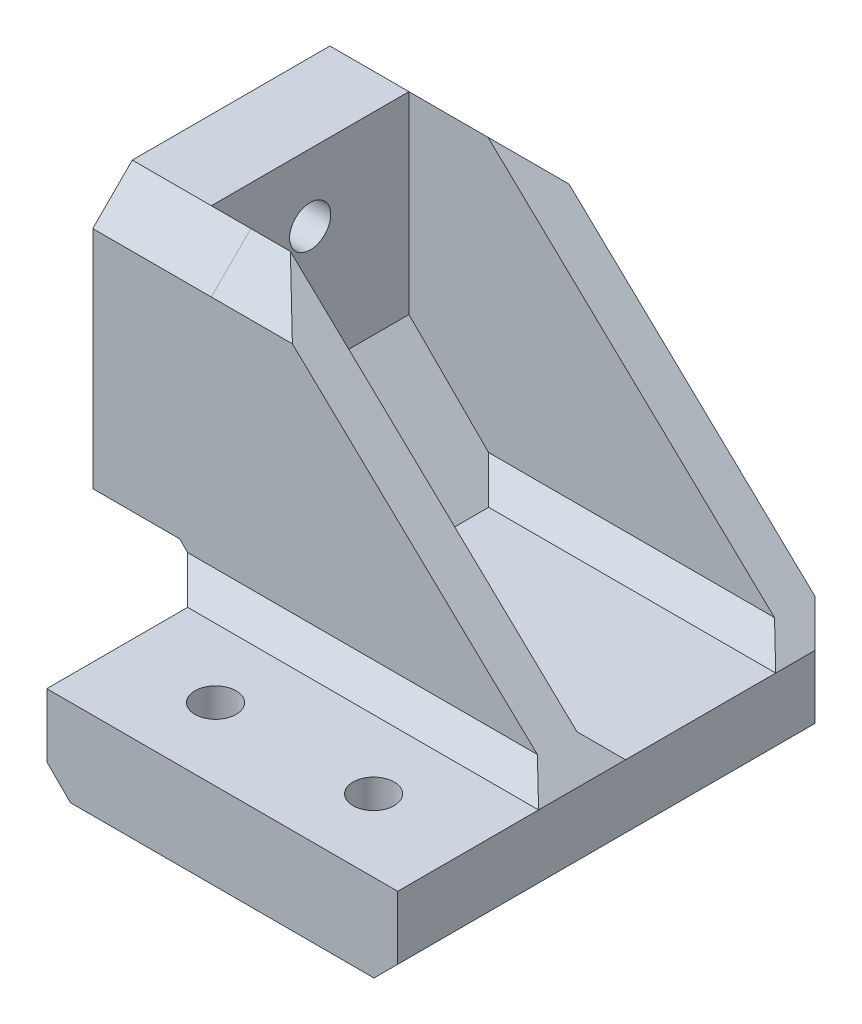
ISO-10303-21;
HEADER;
FILE_DESCRIPTION(('STEP AP214'),'2;1');
FILE_NAME('part.step','',(''),(''),'','','');
FILE_SCHEMA(('AUTOMOTIVE_DESIGN { 1 0 10303 214 1 1 1 1 }'));
ENDSEC;
DATA;
#1=APPLICATION_CONTEXT('core data for automotive mechanical design processes');
#2=APPLICATION_PROTOCOL_DEFINITION('international standard','automotive_design',2000,#1);
#3=PRODUCT_CONTEXT('',#1,'mechanical');
#4=PRODUCT('Part','Part','',(#3));
#5=PRODUCT_RELATED_PRODUCT_CATEGORY('part','',(#4));
#6=PRODUCT_DEFINITION_FORMATION('','',#4);
#7=PRODUCT_DEFINITION_CONTEXT('part definition',#1,'design');
#8=PRODUCT_DEFINITION('design','',#6,#7);
#9=PRODUCT_DEFINITION_SHAPE('','',#8);
#10=(LENGTH_UNIT() NAMED_UNIT(*) SI_UNIT(.MILLI.,.METRE.));
#11=(NAMED_UNIT(*) PLANE_ANGLE_UNIT() SI_UNIT($,.RADIAN.));
#12=(NAMED_UNIT(*) SI_UNIT($,.STERADIAN.) SOLID_ANGLE_UNIT());
#13=UNCERTAINTY_MEASURE_WITH_UNIT(LENGTH_MEASURE(1.E-05),#10,'distance_accuracy_value','');
#14=(GEOMETRIC_REPRESENTATION_CONTEXT(3) GLOBAL_UNCERTAINTY_ASSIGNED_CONTEXT((#13)) GLOBAL_UNIT_ASSIGNED_CONTEXT((#10,
#11,#12)) REPRESENTATION_CONTEXT('',''));
#15=CARTESIAN_POINT('',(0.,0.,0.));
#16=DIRECTION('',(0.,0.,1.));
#17=DIRECTION('',(1.,0.,0.));
#18=AXIS2_PLACEMENT_3D('',#15,#16,#17);
#19=CARTESIAN_POINT('',(0.,11.,0.));
#20=DIRECTION('',(0.,-1.,0.));
#21=DIRECTION('',(0.,0.,-1.));
#22=AXIS2_PLACEMENT_3D('',#19,#20,#21);
#23=PLANE('',#22);
#24=DIRECTION('',(0.,0.,-1.));
#25=VECTOR('',#24,1.);
#26=CARTESIAN_POINT('',(22.2,11.,0.));
#27=LINE('',#26,#25);
#28=CARTESIAN_POINT('',(22.2,11.,-28.82));
#29=VERTEX_POINT('',#28);
#30=CARTESIAN_POINT('',(22.2,11.,-47.82));
#31=VERTEX_POINT('',#30);
#32=EDGE_CURVE('E262',#29,#31,#27,.T.);
#33=ORIENTED_EDGE('',*,*,#32,.T.);
#34=DIRECTION('',(-1.,0.,0.));
#35=VECTOR('',#34,1.);
#36=CARTESIAN_POINT('',(0.,11.,-47.82));
#37=LINE('',#36,#35);
#38=CARTESIAN_POINT('',(-14.1185245480488,11.,-47.82));
#39=VERTEX_POINT('',#38);
#40=EDGE_CURVE('E360',#31,#39,#37,.T.);
#41=ORIENTED_EDGE('',*,*,#40,.T.);
#42=DIRECTION('',(0.,0.,1.));
#43=VECTOR('',#42,1.);
#44=CARTESIAN_POINT('',(-14.1185245480488,11.,-69.32));
#45=LINE('',#44,#43);
#46=CARTESIAN_POINT('',(-14.1185245480488,11.,-28.82));
#47=VERTEX_POINT('',#46);
#48=EDGE_CURVE('E178',#39,#47,#45,.T.);
#49=ORIENTED_EDGE('',*,*,#48,.T.);
#50=DIRECTION('',(1.,0.,0.));
#51=VECTOR('',#50,1.);
#52=CARTESIAN_POINT('',(0.,11.,-28.82));
#53=LINE('',#52,#51);
#54=EDGE_CURVE('E357',#47,#29,#53,.T.);
#55=ORIENTED_EDGE('',*,*,#54,.T.);
#56=EDGE_LOOP('',(#33,#41,#49,#55));
#57=FACE_BOUND('',#56,.T.);
#58=ADVANCED_FACE('F60',(#57),#23,.F.);
#59=CARTESIAN_POINT('',(0.,0.,-50.82));
#60=DIRECTION('',(0.,0.,1.));
#61=DIRECTION('',(1.,0.,0.));
#62=AXIS2_PLACEMENT_3D('',#59,#60,#61);
#63=PLANE('',#62);
#64=DIRECTION('',(-0.707106781186551,0.707106781186544,0.));
#65=VECTOR('',#64,1.);
#66=CARTESIAN_POINT('',(-14.1185245480488,11.,-50.82));
#67=LINE('',#66,#65);
#68=CARTESIAN_POINT('',(-17.1185245480488,14.,-50.82));
#69=VERTEX_POINT('',#68);
#70=CARTESIAN_POINT('',(-27.2,24.0814754519511,-50.82));
#71=VERTEX_POINT('',#70);
#72=EDGE_CURVE('E190',#69,#71,#67,.T.);
#73=ORIENTED_EDGE('',*,*,#72,.F.);
#74=DIRECTION('',(1.,0.,0.));
#75=VECTOR('',#74,1.);
#76=CARTESIAN_POINT('',(0.,14.,-50.82));
#77=LINE('',#76,#75);
#78=CARTESIAN_POINT('',(19.048,14.,-50.82));
#79=VERTEX_POINT('',#78);
#80=EDGE_CURVE('E368',#69,#79,#77,.T.);
#81=ORIENTED_EDGE('',*,*,#80,.T.);
#82=DIRECTION('',(0.724356499682299,-0.689425602489498,0.));
#83=VECTOR('',#82,1.);
#84=CARTESIAN_POINT('',(-17.2,48.5,-50.82));
#85=LINE('',#84,#83);
#86=CARTESIAN_POINT('',(-17.2,48.5,-50.82));
#87=VERTEX_POINT('',#86);
#88=EDGE_CURVE('E239',#87,#79,#85,.T.);
#89=ORIENTED_EDGE('',*,*,#88,.F.);
#90=DIRECTION('',(-1.,0.,0.));
#91=VECTOR('',#90,1.);
#92=CARTESIAN_POINT('',(-17.2,48.5,-50.82));
#93=LINE('',#92,#91);
#94=CARTESIAN_POINT('',(-22.2,48.5,-50.82));
#95=VERTEX_POINT('',#94);
#96=EDGE_CURVE('E299',#87,#95,#93,.T.);
#97=ORIENTED_EDGE('',*,*,#96,.T.);
#98=DIRECTION('',(-1.,0.,0.));
#99=VECTOR('',#98,1.);
#100=CARTESIAN_POINT('',(-17.2,48.5,-50.82));
#101=LINE('',#100,#99);
#102=CARTESIAN_POINT('',(-27.2,48.5,-50.82));
#103=VERTEX_POINT('',#102);
#104=EDGE_CURVE('E315',#95,#103,#101,.T.);
#105=ORIENTED_EDGE('',*,*,#104,.T.);
#106=DIRECTION('',(0.,1.,0.));
#107=VECTOR('',#106,1.);
#108=CARTESIAN_POINT('',(-27.2,14.,-50.82));
#109=LINE('',#108,#107);
#110=EDGE_CURVE('E199',#71,#103,#109,.T.);
#111=ORIENTED_EDGE('',*,*,#110,.F.);
#112=EDGE_LOOP('',(#73,#81,#89,#97,#105,#111));
#113=FACE_BOUND('',#112,.T.);
#114=ADVANCED_FACE('F476',(#113),#63,.T.);
#115=CARTESIAN_POINT('',(0.,0.,-25.82));
#116=DIRECTION('',(0.,0.,-1.));
#117=DIRECTION('',(-1.,0.,0.));
#118=AXIS2_PLACEMENT_3D('',#115,#116,#117);
#119=PLANE('',#118);
#120=DIRECTION('',(-0.724356499682299,0.689425602489498,0.));
#121=VECTOR('',#120,1.);
#122=CARTESIAN_POINT('',(-17.2,48.5,-25.82));
#123=LINE('',#122,#121);
#124=CARTESIAN_POINT('',(19.048,14.,-25.82));
#125=VERTEX_POINT('',#124);
#126=CARTESIAN_POINT('',(-17.2,48.5,-25.82));
#127=VERTEX_POINT('',#126);
#128=EDGE_CURVE('E233',#125,#127,#123,.T.);
#129=ORIENTED_EDGE('',*,*,#128,.F.);
#130=DIRECTION('',(-1.,0.,0.));
#131=VECTOR('',#130,1.);
#132=CARTESIAN_POINT('',(0.,14.,-25.82));
#133=LINE('',#132,#131);
#134=CARTESIAN_POINT('',(-17.1185245480488,14.,-25.82));
#135=VERTEX_POINT('',#134);
#136=EDGE_CURVE('E370',#125,#135,#133,.T.);
#137=ORIENTED_EDGE('',*,*,#136,.T.);
#138=DIRECTION('',(0.707106781186551,-0.707106781186544,0.));
#139=VECTOR('',#138,1.);
#140=CARTESIAN_POINT('',(-14.1185245480488,11.,-25.82));
#141=LINE('',#140,#139);
#142=CARTESIAN_POINT('',(-27.2,24.0814754519511,-25.82));
#143=VERTEX_POINT('',#142);
#144=EDGE_CURVE('E173',#143,#135,#141,.T.);
#145=ORIENTED_EDGE('',*,*,#144,.F.);
#146=DIRECTION('',(0.,-1.,0.));
#147=VECTOR('',#146,1.);
#148=CARTESIAN_POINT('',(-27.2,14.,-25.82));
#149=LINE('',#148,#147);
#150=CARTESIAN_POINT('',(-27.2,48.5,-25.82));
#151=VERTEX_POINT('',#150);
#152=EDGE_CURVE('E194',#151,#143,#149,.T.);
#153=ORIENTED_EDGE('',*,*,#152,.F.);
#154=DIRECTION('',(1.,0.,0.));
#155=VECTOR('',#154,1.);
#156=CARTESIAN_POINT('',(-27.2,48.5,-25.82));
#157=LINE('',#156,#155);
#158=CARTESIAN_POINT('',(-22.2,48.5,-25.82));
#159=VERTEX_POINT('',#158);
#160=EDGE_CURVE('E205',#151,#159,#157,.T.);
#161=ORIENTED_EDGE('',*,*,#160,.T.);
#162=DIRECTION('',(1.,0.,0.));
#163=VECTOR('',#162,1.);
#164=CARTESIAN_POINT('',(-17.2,48.5,-25.82));
#165=LINE('',#164,#163);
#166=EDGE_CURVE('E302',#159,#127,#165,.T.);
#167=ORIENTED_EDGE('',*,*,#166,.T.);
#168=EDGE_LOOP('',(#129,#137,#145,#153,#161,#167));
#169=FACE_BOUND('',#168,.T.);
#170=ADVANCED_FACE('F458',(#169),#119,.T.);
#171=CARTESIAN_POINT('',(-27.2,0.,0.));
#172=DIRECTION('',(-1.,0.,0.));
#173=DIRECTION('',(0.,0.,1.));
#174=AXIS2_PLACEMENT_3D('',#171,#172,#173);
#175=PLANE('',#174);
#176=CARTESIAN_POINT('',(-27.2,40.,-38.32));
#177=DIRECTION('',(-1.,0.,0.));
#178=DIRECTION('',(0.,0.,1.));
#179=AXIS2_PLACEMENT_3D('',#176,#177,#178);
#180=CIRCLE('',#179,2.6);
#181=CARTESIAN_POINT('',(-27.2,40.,-35.72));
#182=VERTEX_POINT('',#181);
#183=EDGE_CURVE('E208',#182,#182,#180,.F.);
#184=ORIENTED_EDGE('',*,*,#183,.F.);
#185=EDGE_LOOP('',(#184));
#186=FACE_BOUND('',#185,.T.);
#187=DIRECTION('',(0.,0.,1.));
#188=VECTOR('',#187,1.);
#189=CARTESIAN_POINT('',(-27.2,24.0814754519511,-69.32));
#190=LINE('',#189,#188);
#191=EDGE_CURVE('E186',#71,#143,#190,.T.);
#192=ORIENTED_EDGE('',*,*,#191,.F.);
#193=ORIENTED_EDGE('',*,*,#110,.T.);
#194=DIRECTION('',(0.,0.,1.));
#195=VECTOR('',#194,1.);
#196=CARTESIAN_POINT('',(-27.2,48.5,-25.82));
#197=LINE('',#196,#195);
#198=EDGE_CURVE('E202',#103,#151,#197,.T.);
#199=ORIENTED_EDGE('',*,*,#198,.T.);
#200=ORIENTED_EDGE('',*,*,#152,.T.);
#201=EDGE_LOOP('',(#192,#193,#199,#200));
#202=FACE_BOUND('',#201,.T.);
#203=ADVANCED_FACE('F482',(#186,#202),#175,.F.);
#204=CARTESIAN_POINT('',(-22.2,11.,0.));
#205=DIRECTION('',(1.,0.,0.));
#206=DIRECTION('',(0.,0.,-1.));
#207=AXIS2_PLACEMENT_3D('',#204,#205,#206);
#208=PLANE('',#207);
#209=DIRECTION('',(0.,0.,1.));
#210=VECTOR('',#209,1.);
#211=CARTESIAN_POINT('',(-22.2,11.,-61.4768542494924));
#212=LINE('',#211,#210);
#213=CARTESIAN_POINT('',(-22.2,11.,-52.82));
#214=VERTEX_POINT('',#213);
#215=CARTESIAN_POINT('',(-22.2,11.,-17.82));
#216=VERTEX_POINT('',#215);
#217=EDGE_CURVE('E101',#214,#216,#212,.T.);
#218=ORIENTED_EDGE('',*,*,#217,.F.);
#219=DIRECTION('',(0.,-1.,0.));
#220=VECTOR('',#219,1.);
#221=CARTESIAN_POINT('',(-22.2,11.,-52.82));
#222=LINE('',#221,#220);
#223=CARTESIAN_POINT('',(-22.2,3.,-52.82));
#224=VERTEX_POINT('',#223);
#225=EDGE_CURVE('E136',#214,#224,#222,.T.);
#226=ORIENTED_EDGE('',*,*,#225,.T.);
#227=DIRECTION('',(0.,0.,1.));
#228=VECTOR('',#227,1.);
#229=CARTESIAN_POINT('',(-22.2,3.,0.));
#230=LINE('',#229,#228);
#231=CARTESIAN_POINT('',(-22.2,3.,0.));
#232=VERTEX_POINT('',#231);
#233=EDGE_CURVE('E288',#224,#232,#230,.T.);
#234=ORIENTED_EDGE('',*,*,#233,.T.);
#235=DIRECTION('',(0.,-1.,0.));
#236=VECTOR('',#235,1.);
#237=CARTESIAN_POINT('',(-22.2,11.,0.));
#238=LINE('',#237,#236);
#239=CARTESIAN_POINT('',(-22.2,11.,0.));
#240=VERTEX_POINT('',#239);
#241=EDGE_CURVE('E270',#240,#232,#238,.T.);
#242=ORIENTED_EDGE('',*,*,#241,.F.);
#243=DIRECTION('',(0.,0.,1.));
#244=VECTOR('',#243,1.);
#245=CARTESIAN_POINT('',(-22.2,11.,0.));
#246=LINE('',#245,#244);
#247=EDGE_CURVE('E140',#216,#240,#246,.T.);
#248=ORIENTED_EDGE('',*,*,#247,.F.);
#249=EDGE_LOOP('',(#218,#226,#234,#242,#248));
#250=FACE_BOUND('',#249,.T.);
#251=ADVANCED_FACE('F133',(#250),#208,.F.);
#252=CARTESIAN_POINT('',(-10.,11.,-9.15));
#253=DIRECTION('',(0.,1.,0.));
#254=DIRECTION('',(0.,0.,1.));
#255=AXIS2_PLACEMENT_3D('',#252,#253,#254);
#256=CIRCLE('',#255,2.6);
#257=CARTESIAN_POINT('',(-10.,11.,-6.55));
#258=VERTEX_POINT('',#257);
#259=EDGE_CURVE('E253',#258,#258,#256,.T.);
#260=ORIENTED_EDGE('',*,*,#259,.F.);
#261=EDGE_LOOP('',(#260));
#262=FACE_BOUND('',#261,.T.);
#263=CARTESIAN_POINT('',(10.,11.,-9.15));
#264=DIRECTION('',(0.,1.,0.));
#265=DIRECTION('',(0.,0.,1.));
#266=AXIS2_PLACEMENT_3D('',#263,#264,#265);
#267=CIRCLE('',#266,2.6);
#268=CARTESIAN_POINT('',(10.,11.,-6.55));
#269=VERTEX_POINT('',#268);
#270=EDGE_CURVE('E250',#269,#269,#267,.T.);
#271=ORIENTED_EDGE('',*,*,#270,.F.);
#272=EDGE_LOOP('',(#271));
#273=FACE_BOUND('',#272,.T.);
#274=CARTESIAN_POINT('',(22.2,11.,0.));
#275=VERTEX_POINT('',#274);
#276=CARTESIAN_POINT('',(22.2,11.,-17.82));
#277=VERTEX_POINT('',#276);
#278=EDGE_CURVE('E263',#275,#277,#27,.T.);
#279=ORIENTED_EDGE('',*,*,#278,.T.);
#280=DIRECTION('',(-1.,0.,0.));
#281=VECTOR('',#280,1.);
#282=CARTESIAN_POINT('',(0.,11.,-17.82));
#283=LINE('',#282,#281);
#284=EDGE_CURVE('E153',#277,#216,#283,.T.);
#285=ORIENTED_EDGE('',*,*,#284,.T.);
#286=ORIENTED_EDGE('',*,*,#247,.T.);
#287=DIRECTION('',(1.,0.,0.));
#288=VECTOR('',#287,1.);
#289=CARTESIAN_POINT('',(-22.2,11.,0.));
#290=LINE('',#289,#288);
#291=EDGE_CURVE('E259',#240,#275,#290,.T.);
#292=ORIENTED_EDGE('',*,*,#291,.T.);
#293=EDGE_LOOP('',(#279,#285,#286,#292));
#294=FACE_BOUND('',#293,.T.);
#295=ADVANCED_FACE('F375',(#262,#273,#294),#23,.F.);
#296=CARTESIAN_POINT('',(-22.2,11.,0.));
#297=DIRECTION('',(0.,0.,-1.));
#298=DIRECTION('',(-1.,0.,0.));
#299=AXIS2_PLACEMENT_3D('',#296,#297,#298);
#300=PLANE('',#299);
#301=DIRECTION('',(1.,0.,0.));
#302=VECTOR('',#301,1.);
#303=CARTESIAN_POINT('',(-22.2,0.,0.));
#304=LINE('',#303,#302);
#305=CARTESIAN_POINT('',(-19.2,0.,0.));
#306=VERTEX_POINT('',#305);
#307=CARTESIAN_POINT('',(19.2,0.,0.));
#308=VERTEX_POINT('',#307);
#309=EDGE_CURVE('E249',#306,#308,#304,.T.);
#310=ORIENTED_EDGE('',*,*,#309,.T.);
#311=DIRECTION('',(0.707106781186548,0.707106781186547,0.));
#312=VECTOR('',#311,1.);
#313=CARTESIAN_POINT('',(22.2,3.,0.));
#314=LINE('',#313,#312);
#315=CARTESIAN_POINT('',(22.2,3.,0.));
#316=VERTEX_POINT('',#315);
#317=EDGE_CURVE('E285',#308,#316,#314,.T.);
#318=ORIENTED_EDGE('',*,*,#317,.T.);
#319=DIRECTION('',(0.,-1.,0.));
#320=VECTOR('',#319,1.);
#321=CARTESIAN_POINT('',(22.2,11.,0.));
#322=LINE('',#321,#320);
#323=EDGE_CURVE('E265',#275,#316,#322,.T.);
#324=ORIENTED_EDGE('',*,*,#323,.F.);
#325=ORIENTED_EDGE('',*,*,#291,.F.);
#326=ORIENTED_EDGE('',*,*,#241,.T.);
#327=DIRECTION('',(0.707106781186548,-0.707106781186547,0.));
#328=VECTOR('',#327,1.);
#329=CARTESIAN_POINT('',(-22.2,3.,0.));
#330=LINE('',#329,#328);
#331=EDGE_CURVE('E282',#232,#306,#330,.T.);
#332=ORIENTED_EDGE('',*,*,#331,.T.);
#333=EDGE_LOOP('',(#310,#318,#324,#325,#326,#332));
#334=FACE_BOUND('',#333,.T.);
#335=ADVANCED_FACE('F542',(#334),#300,.F.);
#336=CARTESIAN_POINT('',(22.2,11.,0.));
#337=DIRECTION('',(-1.,0.,0.));
#338=DIRECTION('',(0.,0.,1.));
#339=AXIS2_PLACEMENT_3D('',#336,#337,#338);
#340=PLANE('',#339);
#341=DIRECTION('',(0.,0.,-1.));
#342=VECTOR('',#341,1.);
#343=CARTESIAN_POINT('',(22.2,3.,-55.82));
#344=LINE('',#343,#342);
#345=CARTESIAN_POINT('',(22.2,3.,-52.82));
#346=VERTEX_POINT('',#345);
#347=EDGE_CURVE('E273',#316,#346,#344,.T.);
#348=ORIENTED_EDGE('',*,*,#347,.T.);
#349=DIRECTION('',(0.,1.,0.));
#350=VECTOR('',#349,1.);
#351=CARTESIAN_POINT('',(22.2,11.,-52.82));
#352=LINE('',#351,#350);
#353=CARTESIAN_POINT('',(22.2,11.,-52.82));
#354=VERTEX_POINT('',#353);
#355=EDGE_CURVE('E148',#346,#354,#352,.T.);
#356=ORIENTED_EDGE('',*,*,#355,.T.);
#357=DIRECTION('',(0.,0.,-1.));
#358=VECTOR('',#357,1.);
#359=CARTESIAN_POINT('',(22.2,11.,-50.82));
#360=LINE('',#359,#358);
#361=EDGE_CURVE('E85',#31,#354,#360,.T.);
#362=ORIENTED_EDGE('',*,*,#361,.F.);
#363=ORIENTED_EDGE('',*,*,#32,.F.);
#364=DIRECTION('',(0.,0.,1.));
#365=VECTOR('',#364,1.);
#366=CARTESIAN_POINT('',(22.2,11.,-25.82));
#367=LINE('',#366,#365);
#368=EDGE_CURVE('E78',#29,#277,#367,.T.);
#369=ORIENTED_EDGE('',*,*,#368,.T.);
#370=ORIENTED_EDGE('',*,*,#278,.F.);
#371=ORIENTED_EDGE('',*,*,#323,.T.);
#372=EDGE_LOOP('',(#348,#356,#362,#363,#369,#370,#371));
#373=FACE_BOUND('',#372,.T.);
#374=ADVANCED_FACE('F547',(#373),#340,.F.);
#375=CARTESIAN_POINT('',(-22.2,11.,-55.82));
#376=DIRECTION('',(0.,0.,1.));
#377=DIRECTION('',(1.,0.,0.));
#378=AXIS2_PLACEMENT_3D('',#375,#376,#377);
#379=PLANE('',#378);
#380=DIRECTION('',(0.,1.,0.));
#381=VECTOR('',#380,1.);
#382=CARTESIAN_POINT('',(-19.2,11.,-55.82));
#383=LINE('',#382,#381);
#384=CARTESIAN_POINT('',(-19.2,3.00000000000002,-55.82));
#385=VERTEX_POINT('',#384);
#386=CARTESIAN_POINT('',(-19.2,7.99999999999999,-55.82));
#387=VERTEX_POINT('',#386);
#388=EDGE_CURVE('E342',#385,#387,#383,.T.);
#389=ORIENTED_EDGE('',*,*,#388,.T.);
#390=DIRECTION('',(-0.707106781186548,0.707106781186548,0.));
#391=VECTOR('',#390,1.);
#392=CARTESIAN_POINT('',(-26.2,15.,-55.82));
#393=LINE('',#392,#391);
#394=CARTESIAN_POINT('',(-26.2,15.,-55.82));
#395=VERTEX_POINT('',#394);
#396=EDGE_CURVE('E125',#387,#395,#393,.T.);
#397=ORIENTED_EDGE('',*,*,#396,.T.);
#398=DIRECTION('',(1.,0.,0.));
#399=VECTOR('',#398,1.);
#400=CARTESIAN_POINT('',(-37.2,15.,-55.82));
#401=LINE('',#400,#399);
#402=CARTESIAN_POINT('',(-37.2,15.,-55.82));
#403=VERTEX_POINT('',#402);
#404=EDGE_CURVE('E229',#403,#395,#401,.T.);
#405=ORIENTED_EDGE('',*,*,#404,.F.);
#406=DIRECTION('',(0.,-1.,0.));
#407=VECTOR('',#406,1.);
#408=CARTESIAN_POINT('',(-37.2,0.,-55.82));
#409=LINE('',#408,#407);
#410=CARTESIAN_POINT('',(-37.2,43.5,-55.82));
#411=VERTEX_POINT('',#410);
#412=EDGE_CURVE('E214',#411,#403,#409,.T.);
#413=ORIENTED_EDGE('',*,*,#412,.F.);
#414=DIRECTION('',(1.,0.,0.));
#415=VECTOR('',#414,1.);
#416=CARTESIAN_POINT('',(-22.2,43.5,-55.82));
#417=LINE('',#416,#415);
#418=CARTESIAN_POINT('',(-22.2,43.5,-55.82));
#419=VERTEX_POINT('',#418);
#420=EDGE_CURVE('E330',#411,#419,#417,.T.);
#421=ORIENTED_EDGE('',*,*,#420,.T.);
#422=DIRECTION('',(1.,0.,0.));
#423=VECTOR('',#422,1.);
#424=CARTESIAN_POINT('',(-22.2,43.5,-55.82));
#425=LINE('',#424,#423);
#426=CARTESIAN_POINT('',(-11.9466666666667,43.5,-55.82));
#427=VERTEX_POINT('',#426);
#428=EDGE_CURVE('E308',#419,#427,#425,.T.);
#429=ORIENTED_EDGE('',*,*,#428,.T.);
#430=DIRECTION('',(0.724356499682299,-0.689425602489498,0.));
#431=VECTOR('',#430,1.);
#432=CARTESIAN_POINT('',(-17.2,48.5,-55.82));
#433=LINE('',#432,#431);
#434=CARTESIAN_POINT('',(19.2,13.8553299492386,-55.82));
#435=VERTEX_POINT('',#434);
#436=EDGE_CURVE('E238',#427,#435,#433,.T.);
#437=ORIENTED_EDGE('',*,*,#436,.T.);
#438=DIRECTION('',(0.,-1.,0.));
#439=VECTOR('',#438,1.);
#440=CARTESIAN_POINT('',(19.2,11.,-55.82));
#441=LINE('',#440,#439);
#442=CARTESIAN_POINT('',(19.2,3.00000000000002,-55.82));
#443=VERTEX_POINT('',#442);
#444=EDGE_CURVE('E336',#435,#443,#441,.T.);
#445=ORIENTED_EDGE('',*,*,#444,.T.);
#446=DIRECTION('',(-1.,0.,0.));
#447=VECTOR('',#446,1.);
#448=CARTESIAN_POINT('',(-19.2,3.00000000000002,-55.82));
#449=LINE('',#448,#447);
#450=EDGE_CURVE('E339',#443,#385,#449,.T.);
#451=ORIENTED_EDGE('',*,*,#450,.T.);
#452=EDGE_LOOP('',(#389,#397,#405,#413,#421,#429,#437,#445,#451));
#453=FACE_BOUND('',#452,.T.);
#454=ADVANCED_FACE('F516',(#453),#379,.F.);
#455=CARTESIAN_POINT('',(0.,0.,0.));
#456=DIRECTION('',(0.,-1.,0.));
#457=DIRECTION('',(0.,0.,-1.));
#458=AXIS2_PLACEMENT_3D('',#455,#456,#457);
#459=PLANE('',#458);
#460=CARTESIAN_POINT('',(10.,0.,-9.15));
#461=DIRECTION('',(0.,1.,0.));
#462=DIRECTION('',(0.,0.,1.));
#463=AXIS2_PLACEMENT_3D('',#460,#461,#462);
#464=CIRCLE('',#463,2.6);
#465=CARTESIAN_POINT('',(10.,0.,-6.55));
#466=VERTEX_POINT('',#465);
#467=EDGE_CURVE('E246',#466,#466,#464,.T.);
#468=ORIENTED_EDGE('',*,*,#467,.T.);
#469=EDGE_LOOP('',(#468));
#470=FACE_BOUND('',#469,.T.);
#471=CARTESIAN_POINT('',(-10.,0.,-9.15));
#472=DIRECTION('',(0.,1.,0.));
#473=DIRECTION('',(0.,0.,1.));
#474=AXIS2_PLACEMENT_3D('',#471,#472,#473);
#475=CIRCLE('',#474,2.6);
#476=CARTESIAN_POINT('',(-10.,0.,-6.55));
#477=VERTEX_POINT('',#476);
#478=EDGE_CURVE('E245',#477,#477,#475,.T.);
#479=ORIENTED_EDGE('',*,*,#478,.T.);
#480=EDGE_LOOP('',(#479));
#481=FACE_BOUND('',#480,.T.);
#482=DIRECTION('',(0.,0.,-1.));
#483=VECTOR('',#482,1.);
#484=CARTESIAN_POINT('',(-19.2,0.,-55.82));
#485=LINE('',#484,#483);
#486=CARTESIAN_POINT('',(-19.2,0.,-52.82));
#487=VERTEX_POINT('',#486);
#488=EDGE_CURVE('E276',#306,#487,#485,.T.);
#489=ORIENTED_EDGE('',*,*,#488,.T.);
#490=DIRECTION('',(1.,0.,0.));
#491=VECTOR('',#490,1.);
#492=CARTESIAN_POINT('',(19.2,0.,-52.82));
#493=LINE('',#492,#491);
#494=CARTESIAN_POINT('',(19.2,0.,-52.82));
#495=VERTEX_POINT('',#494);
#496=EDGE_CURVE('E348',#487,#495,#493,.T.);
#497=ORIENTED_EDGE('',*,*,#496,.T.);
#498=DIRECTION('',(0.,0.,1.));
#499=VECTOR('',#498,1.);
#500=CARTESIAN_POINT('',(19.2,0.,0.));
#501=LINE('',#500,#499);
#502=EDGE_CURVE('E279',#495,#308,#501,.T.);
#503=ORIENTED_EDGE('',*,*,#502,.T.);
#504=ORIENTED_EDGE('',*,*,#309,.F.);
#505=EDGE_LOOP('',(#489,#497,#503,#504));
#506=FACE_BOUND('',#505,.T.);
#507=ADVANCED_FACE('F538',(#470,#481,#506),#459,.T.);
#508=CARTESIAN_POINT('',(22.2,3.,0.));
#509=DIRECTION('',(0.707106781186547,-0.707106781186548,0.));
#510=DIRECTION('',(0.,0.,1.));
#511=AXIS2_PLACEMENT_3D('',#508,#509,#510);
#512=PLANE('',#511);
#513=ORIENTED_EDGE('',*,*,#502,.F.);
#514=DIRECTION('',(0.577350269189627,0.577350269189625,-0.577350269189625));
#515=VECTOR('',#514,1.);
#516=CARTESIAN_POINT('',(3.59333333333332,-15.6066666666666,-37.2133333333334));
#517=LINE('',#516,#515);
#518=CARTESIAN_POINT('',(20.7,1.49999999999999,-54.32));
#519=VERTEX_POINT('',#518);
#520=EDGE_CURVE('E354',#495,#519,#517,.T.);
#521=ORIENTED_EDGE('',*,*,#520,.T.);
#522=DIRECTION('',(-0.577350269189626,-0.577350269189625,-0.577350269189626));
#523=VECTOR('',#522,1.);
#524=CARTESIAN_POINT('',(39.8066666666667,20.6066666666666,-35.2133333333333));
#525=LINE('',#524,#523);
#526=EDGE_CURVE('E351',#519,#346,#525,.F.);
#527=ORIENTED_EDGE('',*,*,#526,.T.);
#528=ORIENTED_EDGE('',*,*,#347,.F.);
#529=ORIENTED_EDGE('',*,*,#317,.F.);
#530=EDGE_LOOP('',(#513,#521,#527,#528,#529));
#531=FACE_BOUND('',#530,.T.);
#532=ADVANCED_FACE('F546',(#531),#512,.T.);
#533=CARTESIAN_POINT('',(-22.2,3.,0.));
#534=DIRECTION('',(-0.707106781186547,-0.707106781186548,0.));
#535=DIRECTION('',(0.,0.,-1.));
#536=AXIS2_PLACEMENT_3D('',#533,#534,#535);
#537=PLANE('',#536);
#538=DIRECTION('',(-0.577350269189627,0.577350269189626,0.577350269189625));
#539=VECTOR('',#538,1.);
#540=CARTESIAN_POINT('',(-39.8066666666667,20.6066666666666,-35.2133333333334));
#541=LINE('',#540,#539);
#542=CARTESIAN_POINT('',(-20.7,1.49999999999999,-54.32));
#543=VERTEX_POINT('',#542);
#544=EDGE_CURVE('E147',#224,#543,#541,.F.);
#545=ORIENTED_EDGE('',*,*,#544,.T.);
#546=DIRECTION('',(0.577350269189627,-0.577350269189625,0.577350269189625));
#547=VECTOR('',#546,1.);
#548=CARTESIAN_POINT('',(-3.59333333333332,-15.6066666666666,-37.2133333333334));
#549=LINE('',#548,#547);
#550=EDGE_CURVE('E345',#543,#487,#549,.T.);
#551=ORIENTED_EDGE('',*,*,#550,.T.);
#552=ORIENTED_EDGE('',*,*,#488,.F.);
#553=ORIENTED_EDGE('',*,*,#331,.F.);
#554=ORIENTED_EDGE('',*,*,#233,.F.);
#555=EDGE_LOOP('',(#545,#551,#552,#553,#554));
#556=FACE_BOUND('',#555,.T.);
#557=ADVANCED_FACE('F534',(#556),#537,.T.);
#558=CARTESIAN_POINT('',(-10.,0.,-9.15));
#559=DIRECTION('',(0.,1.,0.));
#560=DIRECTION('',(0.,0.,1.));
#561=AXIS2_PLACEMENT_3D('',#558,#559,#560);
#562=CYLINDRICAL_SURFACE('',#561,2.6);
#563=ORIENTED_EDGE('',*,*,#478,.F.);
#564=EDGE_LOOP('',(#563));
#565=FACE_BOUND('',#564,.T.);
#566=ORIENTED_EDGE('',*,*,#259,.T.);
#567=EDGE_LOOP('',(#566));
#568=FACE_BOUND('',#567,.T.);
#569=ADVANCED_FACE('F577',(#565,#568),#562,.F.);
#570=CARTESIAN_POINT('',(10.,0.,-9.15));
#571=DIRECTION('',(0.,1.,0.));
#572=DIRECTION('',(0.,0.,1.));
#573=AXIS2_PLACEMENT_3D('',#570,#571,#572);
#574=CYLINDRICAL_SURFACE('',#573,2.6);
#575=ORIENTED_EDGE('',*,*,#467,.F.);
#576=EDGE_LOOP('',(#575));
#577=FACE_BOUND('',#576,.T.);
#578=ORIENTED_EDGE('',*,*,#270,.T.);
#579=EDGE_LOOP('',(#578));
#580=FACE_BOUND('',#579,.T.);
#581=ADVANCED_FACE('F575',(#577,#580),#574,.F.);
#582=CARTESIAN_POINT('',(-17.2,48.5,-55.82));
#583=DIRECTION('',(0.,-1.,0.));
#584=DIRECTION('',(0.,0.,-1.));
#585=AXIS2_PLACEMENT_3D('',#582,#583,#584);
#586=PLANE('',#585);
#587=DIRECTION('',(1.,0.,0.));
#588=VECTOR('',#587,1.);
#589=CARTESIAN_POINT('',(-22.2,48.5,-25.82));
#590=LINE('',#589,#588);
#591=CARTESIAN_POINT('',(-37.2,48.5,-25.82));
#592=VERTEX_POINT('',#591);
#593=EDGE_CURVE('E318',#592,#151,#590,.T.);
#594=ORIENTED_EDGE('',*,*,#593,.T.);
#595=ORIENTED_EDGE('',*,*,#198,.F.);
#596=CARTESIAN_POINT('',(-37.2,48.5,-50.82));
#597=VERTEX_POINT('',#596);
#598=EDGE_CURVE('E314',#103,#597,#101,.T.);
#599=ORIENTED_EDGE('',*,*,#598,.T.);
#600=DIRECTION('',(0.,0.,-1.));
#601=VECTOR('',#600,1.);
#602=CARTESIAN_POINT('',(-37.2,48.5,0.));
#603=LINE('',#602,#601);
#604=EDGE_CURVE('E223',#592,#597,#603,.T.);
#605=ORIENTED_EDGE('',*,*,#604,.F.);
#606=EDGE_LOOP('',(#594,#595,#599,#605));
#607=FACE_BOUND('',#606,.T.);
#608=ADVANCED_FACE('F506',(#607),#586,.F.);
#609=CARTESIAN_POINT('',(-17.2,11.,-20.82));
#610=DIRECTION('',(0.,0.,1.));
#611=DIRECTION('',(0.,-1.,0.));
#612=AXIS2_PLACEMENT_3D('',#609,#610,#611);
#613=PLANE('',#612);
#614=DIRECTION('',(0.707106781186548,-0.707106781186548,0.));
#615=VECTOR('',#614,1.);
#616=CARTESIAN_POINT('',(-26.2,15.,-20.82));
#617=LINE('',#616,#615);
#618=CARTESIAN_POINT('',(-26.2,15.,-20.82));
#619=VERTEX_POINT('',#618);
#620=CARTESIAN_POINT('',(-25.2,14.,-20.82));
#621=VERTEX_POINT('',#620);
#622=EDGE_CURVE('E141',#619,#621,#617,.T.);
#623=ORIENTED_EDGE('',*,*,#622,.T.);
#624=DIRECTION('',(1.,0.,0.));
#625=VECTOR('',#624,1.);
#626=CARTESIAN_POINT('',(-17.2,14.,-20.82));
#627=LINE('',#626,#625);
#628=CARTESIAN_POINT('',(19.048,14.,-20.82));
#629=VERTEX_POINT('',#628);
#630=EDGE_CURVE('E149',#621,#629,#627,.T.);
#631=ORIENTED_EDGE('',*,*,#630,.T.);
#632=DIRECTION('',(-0.724356499682299,0.689425602489498,0.));
#633=VECTOR('',#632,1.);
#634=CARTESIAN_POINT('',(-17.2,48.5,-20.82));
#635=LINE('',#634,#633);
#636=CARTESIAN_POINT('',(-11.9466666666667,43.5,-20.82));
#637=VERTEX_POINT('',#636);
#638=EDGE_CURVE('E232',#629,#637,#635,.T.);
#639=ORIENTED_EDGE('',*,*,#638,.T.);
#640=DIRECTION('',(-1.,0.,0.));
#641=VECTOR('',#640,1.);
#642=CARTESIAN_POINT('',(-22.2,43.5,-20.82));
#643=LINE('',#642,#641);
#644=CARTESIAN_POINT('',(-22.2,43.5,-20.82));
#645=VERTEX_POINT('',#644);
#646=EDGE_CURVE('E290',#637,#645,#643,.T.);
#647=ORIENTED_EDGE('',*,*,#646,.T.);
#648=DIRECTION('',(-1.,0.,0.));
#649=VECTOR('',#648,1.);
#650=CARTESIAN_POINT('',(-37.2,43.5,-20.82));
#651=LINE('',#650,#649);
#652=CARTESIAN_POINT('',(-37.2,43.5,-20.82));
#653=VERTEX_POINT('',#652);
#654=EDGE_CURVE('E321',#645,#653,#651,.T.);
#655=ORIENTED_EDGE('',*,*,#654,.T.);
#656=DIRECTION('',(0.,1.,0.));
#657=VECTOR('',#656,1.);
#658=CARTESIAN_POINT('',(-37.2,0.,-20.82));
#659=LINE('',#658,#657);
#660=CARTESIAN_POINT('',(-37.2,15.,-20.82));
#661=VERTEX_POINT('',#660);
#662=EDGE_CURVE('E220',#661,#653,#659,.T.);
#663=ORIENTED_EDGE('',*,*,#662,.F.);
#664=DIRECTION('',(1.,0.,0.));
#665=VECTOR('',#664,1.);
#666=CARTESIAN_POINT('',(-37.2,15.,-20.82));
#667=LINE('',#666,#665);
#668=EDGE_CURVE('E226',#661,#619,#667,.T.);
#669=ORIENTED_EDGE('',*,*,#668,.T.);
#670=EDGE_LOOP('',(#623,#631,#639,#647,#655,#663,#669));
#671=FACE_BOUND('',#670,.T.);
#672=ADVANCED_FACE('F384',(#671),#613,.T.);
#673=CARTESIAN_POINT('',(-17.2,40.,-38.32));
#674=DIRECTION('',(-1.,0.,0.));
#675=DIRECTION('',(0.,0.,1.));
#676=AXIS2_PLACEMENT_3D('',#673,#674,#675);
#677=CYLINDRICAL_SURFACE('',#676,2.6);
#678=ORIENTED_EDGE('',*,*,#183,.T.);
#679=EDGE_LOOP('',(#678));
#680=FACE_BOUND('',#679,.T.);
#681=CARTESIAN_POINT('',(-37.2,40.,-38.32));
#682=DIRECTION('',(-1.,0.,0.));
#683=DIRECTION('',(0.,0.,1.));
#684=AXIS2_PLACEMENT_3D('',#681,#682,#683);
#685=CIRCLE('',#684,2.6);
#686=CARTESIAN_POINT('',(-37.2,40.,-35.72));
#687=VERTEX_POINT('',#686);
#688=EDGE_CURVE('E211',#687,#687,#685,.F.);
#689=ORIENTED_EDGE('',*,*,#688,.F.);
#690=EDGE_LOOP('',(#689));
#691=FACE_BOUND('',#690,.T.);
#692=ADVANCED_FACE('F591',(#680,#691),#677,.F.);
#693=CARTESIAN_POINT('',(-17.2,48.5,-50.82));
#694=DIRECTION('',(0.689425602489498,0.724356499682299,0.));
#695=DIRECTION('',(-0.724356499682299,0.689425602489498,0.));
#696=AXIS2_PLACEMENT_3D('',#693,#694,#695);
#697=PLANE('',#696);
#698=ORIENTED_EDGE('',*,*,#361,.T.);
#699=DIRECTION('',(0.586625925509229,-0.558336858035434,0.586625925509229));
#700=VECTOR('',#699,1.);
#701=CARTESIAN_POINT('',(-2.95301897374623,34.9400561298346,-77.9730189737462));
#702=LINE('',#701,#700);
#703=EDGE_CURVE('E151',#354,#435,#702,.F.);
#704=ORIENTED_EDGE('',*,*,#703,.T.);
#705=ORIENTED_EDGE('',*,*,#436,.F.);
#706=DIRECTION('',(0.596363510484288,-0.567604864039614,-0.567604864039613));
#707=VECTOR('',#706,1.);
#708=CARTESIAN_POINT('',(-17.2,48.5,-50.82));
#709=LINE('',#708,#707);
#710=EDGE_CURVE('E311',#427,#87,#709,.F.);
#711=ORIENTED_EDGE('',*,*,#710,.T.);
#712=ORIENTED_EDGE('',*,*,#88,.T.);
#713=DIRECTION('',(0.596363510484285,-0.567604864039611,0.567604864039619));
#714=VECTOR('',#713,1.);
#715=CARTESIAN_POINT('',(14.3045825066555,18.5146740101629,-55.334674010163));
#716=LINE('',#715,#714);
#717=EDGE_CURVE('E159',#79,#31,#716,.T.);
#718=ORIENTED_EDGE('',*,*,#717,.T.);
#719=EDGE_LOOP('',(#698,#704,#705,#711,#712,#718));
#720=FACE_BOUND('',#719,.T.);
#721=ADVANCED_FACE('F523',(#720),#697,.T.);
#722=CARTESIAN_POINT('',(-17.2,48.5,-25.82));
#723=DIRECTION('',(0.689425602489498,0.724356499682299,0.));
#724=DIRECTION('',(-0.724356499682299,0.689425602489498,0.));
#725=AXIS2_PLACEMENT_3D('',#722,#723,#724);
#726=PLANE('',#725);
#727=ORIENTED_EDGE('',*,*,#368,.F.);
#728=DIRECTION('',(-0.596363510484286,0.567604864039612,0.567604864039617));
#729=VECTOR('',#728,1.);
#730=CARTESIAN_POINT('',(14.3045825066555,18.5146740101629,-21.305325989837));
#731=LINE('',#730,#729);
#732=EDGE_CURVE('E111',#29,#125,#731,.T.);
#733=ORIENTED_EDGE('',*,*,#732,.T.);
#734=ORIENTED_EDGE('',*,*,#128,.T.);
#735=DIRECTION('',(0.596363510484287,-0.567604864039613,0.567604864039615));
#736=VECTOR('',#735,1.);
#737=CARTESIAN_POINT('',(-17.2,48.5,-25.82));
#738=LINE('',#737,#736);
#739=EDGE_CURVE('E305',#127,#637,#738,.T.);
#740=ORIENTED_EDGE('',*,*,#739,.T.);
#741=ORIENTED_EDGE('',*,*,#638,.F.);
#742=DIRECTION('',(0.596363510484286,-0.567604864039612,0.567604864039618));
#743=VECTOR('',#742,1.);
#744=CARTESIAN_POINT('',(14.3045825066555,18.5146740101629,-25.334674010163));
#745=LINE('',#744,#743);
#746=EDGE_CURVE('E70',#629,#277,#745,.T.);
#747=ORIENTED_EDGE('',*,*,#746,.T.);
#748=EDGE_LOOP('',(#727,#733,#734,#740,#741,#747));
#749=FACE_BOUND('',#748,.T.);
#750=ADVANCED_FACE('F502',(#749),#726,.T.);
#751=CARTESIAN_POINT('',(-17.2,43.5,-20.82));
#752=DIRECTION('',(0.,0.707106781186548,0.707106781186546));
#753=DIRECTION('',(1.,0.,0.));
#754=AXIS2_PLACEMENT_3D('',#751,#752,#753);
#755=PLANE('',#754);
#756=ORIENTED_EDGE('',*,*,#739,.F.);
#757=ORIENTED_EDGE('',*,*,#166,.F.);
#758=DIRECTION('',(0.,0.707106781186547,-0.707106781186549));
#759=VECTOR('',#758,1.);
#760=CARTESIAN_POINT('',(-22.2,43.5,-20.82));
#761=LINE('',#760,#759);
#762=EDGE_CURVE('E296',#645,#159,#761,.T.);
#763=ORIENTED_EDGE('',*,*,#762,.F.);
#764=ORIENTED_EDGE('',*,*,#646,.F.);
#765=EDGE_LOOP('',(#756,#757,#763,#764));
#766=FACE_BOUND('',#765,.T.);
#767=ADVANCED_FACE('F501',(#766),#755,.T.);
#768=CARTESIAN_POINT('',(-17.2,48.5,-50.82));
#769=DIRECTION('',(0.,-0.707106781186546,0.707106781186548));
#770=DIRECTION('',(-1.,0.,0.));
#771=AXIS2_PLACEMENT_3D('',#768,#769,#770);
#772=PLANE('',#771);
#773=ORIENTED_EDGE('',*,*,#710,.F.);
#774=ORIENTED_EDGE('',*,*,#428,.F.);
#775=DIRECTION('',(0.,0.707106781186549,0.707106781186547));
#776=VECTOR('',#775,1.);
#777=CARTESIAN_POINT('',(-22.2,48.5,-50.82));
#778=LINE('',#777,#776);
#779=EDGE_CURVE('E293',#95,#419,#778,.F.);
#780=ORIENTED_EDGE('',*,*,#779,.F.);
#781=ORIENTED_EDGE('',*,*,#96,.F.);
#782=EDGE_LOOP('',(#773,#774,#780,#781));
#783=FACE_BOUND('',#782,.T.);
#784=ADVANCED_FACE('F520',(#783),#772,.F.);
#785=CARTESIAN_POINT('',(-37.2,15.,0.));
#786=DIRECTION('',(0.,1.,0.));
#787=DIRECTION('',(0.,0.,1.));
#788=AXIS2_PLACEMENT_3D('',#785,#786,#787);
#789=PLANE('',#788);
#790=ORIENTED_EDGE('',*,*,#404,.T.);
#791=DIRECTION('',(0.,0.,1.));
#792=VECTOR('',#791,1.);
#793=CARTESIAN_POINT('',(-26.2,15.,0.));
#794=LINE('',#793,#792);
#795=EDGE_CURVE('E333',#395,#619,#794,.T.);
#796=ORIENTED_EDGE('',*,*,#795,.T.);
#797=ORIENTED_EDGE('',*,*,#668,.F.);
#798=DIRECTION('',(0.,0.,1.));
#799=VECTOR('',#798,1.);
#800=CARTESIAN_POINT('',(-37.2,15.,0.));
#801=LINE('',#800,#799);
#802=EDGE_CURVE('E217',#403,#661,#801,.T.);
#803=ORIENTED_EDGE('',*,*,#802,.F.);
#804=EDGE_LOOP('',(#790,#796,#797,#803));
#805=FACE_BOUND('',#804,.T.);
#806=ADVANCED_FACE('F394',(#805),#789,.F.);
#807=CARTESIAN_POINT('',(-37.2,0.,0.));
#808=DIRECTION('',(-1.,0.,0.));
#809=DIRECTION('',(0.,0.,1.));
#810=AXIS2_PLACEMENT_3D('',#807,#808,#809);
#811=PLANE('',#810);
#812=ORIENTED_EDGE('',*,*,#688,.T.);
#813=EDGE_LOOP('',(#812));
#814=FACE_BOUND('',#813,.T.);
#815=ORIENTED_EDGE('',*,*,#662,.T.);
#816=DIRECTION('',(0.,0.707106781186549,-0.707106781186547));
#817=VECTOR('',#816,1.);
#818=CARTESIAN_POINT('',(-37.2,11.3399999999999,11.34));
#819=LINE('',#818,#817);
#820=EDGE_CURVE('E327',#653,#592,#819,.T.);
#821=ORIENTED_EDGE('',*,*,#820,.T.);
#822=ORIENTED_EDGE('',*,*,#604,.T.);
#823=DIRECTION('',(0.,0.707106781186548,0.707106781186548));
#824=VECTOR('',#823,1.);
#825=CARTESIAN_POINT('',(-37.2,49.66,-49.66));
#826=LINE('',#825,#824);
#827=EDGE_CURVE('E324',#597,#411,#826,.F.);
#828=ORIENTED_EDGE('',*,*,#827,.T.);
#829=ORIENTED_EDGE('',*,*,#412,.T.);
#830=ORIENTED_EDGE('',*,*,#802,.T.);
#831=EDGE_LOOP('',(#815,#821,#822,#828,#829,#830));
#832=FACE_BOUND('',#831,.T.);
#833=ADVANCED_FACE('F503',(#814,#832),#811,.T.);
#834=CARTESIAN_POINT('',(-17.2,48.5,-25.82));
#835=DIRECTION('',(0.,0.707106781186546,0.707106781186548));
#836=DIRECTION('',(-1.,0.,0.));
#837=AXIS2_PLACEMENT_3D('',#834,#835,#836);
#838=PLANE('',#837);
#839=ORIENTED_EDGE('',*,*,#820,.F.);
#840=ORIENTED_EDGE('',*,*,#654,.F.);
#841=ORIENTED_EDGE('',*,*,#762,.T.);
#842=ORIENTED_EDGE('',*,*,#160,.F.);
#843=ORIENTED_EDGE('',*,*,#593,.F.);
#844=EDGE_LOOP('',(#839,#840,#841,#842,#843));
#845=FACE_BOUND('',#844,.T.);
#846=ADVANCED_FACE('F498',(#845),#838,.T.);
#847=CARTESIAN_POINT('',(-22.2,43.5,-55.82));
#848=DIRECTION('',(0.,-0.707106781186547,0.707106781186547));
#849=DIRECTION('',(1.,0.,0.));
#850=AXIS2_PLACEMENT_3D('',#847,#848,#849);
#851=PLANE('',#850);
#852=ORIENTED_EDGE('',*,*,#827,.F.);
#853=ORIENTED_EDGE('',*,*,#598,.F.);
#854=ORIENTED_EDGE('',*,*,#104,.F.);
#855=ORIENTED_EDGE('',*,*,#779,.T.);
#856=ORIENTED_EDGE('',*,*,#420,.F.);
#857=EDGE_LOOP('',(#852,#853,#854,#855,#856));
#858=FACE_BOUND('',#857,.T.);
#859=ADVANCED_FACE('F512',(#858),#851,.F.);
#860=CARTESIAN_POINT('',(-26.2,15.,-61.4768542494924));
#861=DIRECTION('',(-0.707106781186548,-0.707106781186548,0.));
#862=DIRECTION('',(0.707106781186548,-0.707106781186548,0.));
#863=AXIS2_PLACEMENT_3D('',#860,#861,#862);
#864=PLANE('',#863);
#865=ORIENTED_EDGE('',*,*,#396,.F.);
#866=DIRECTION('',(0.577350269189627,-0.577350269189627,-0.577350269189624));
#867=VECTOR('',#866,1.);
#868=CARTESIAN_POINT('',(-22.2,11.,-52.82));
#869=LINE('',#868,#867);
#870=EDGE_CURVE('E12',#387,#214,#869,.F.);
#871=ORIENTED_EDGE('',*,*,#870,.T.);
#872=ORIENTED_EDGE('',*,*,#217,.T.);
#873=DIRECTION('',(-0.577350269189624,0.577350269189624,-0.577350269189629));
#874=VECTOR('',#873,1.);
#875=CARTESIAN_POINT('',(-14.8,3.60000000000005,-10.4199999999999));
#876=LINE('',#875,#874);
#877=EDGE_CURVE('E163',#216,#621,#876,.T.);
#878=ORIENTED_EDGE('',*,*,#877,.T.);
#879=ORIENTED_EDGE('',*,*,#622,.F.);
#880=ORIENTED_EDGE('',*,*,#795,.F.);
#881=EDGE_LOOP('',(#865,#871,#872,#878,#879,#880));
#882=FACE_BOUND('',#881,.T.);
#883=ADVANCED_FACE('F121',(#882),#864,.T.);
#884=CARTESIAN_POINT('',(-14.1185245480488,11.,-69.32));
#885=DIRECTION('',(-0.707106781186544,-0.707106781186551,0.));
#886=DIRECTION('',(0.707106781186551,-0.707106781186544,0.));
#887=AXIS2_PLACEMENT_3D('',#884,#885,#886);
#888=PLANE('',#887);
#889=ORIENTED_EDGE('',*,*,#48,.F.);
#890=DIRECTION('',(-0.577350269189627,0.577350269189621,-0.577350269189629));
#891=VECTOR('',#890,1.);
#892=CARTESIAN_POINT('',(-9.41234969869918,6.29382515065044,-43.1138251506503));
#893=LINE('',#892,#891);
#894=EDGE_CURVE('E365',#39,#69,#893,.T.);
#895=ORIENTED_EDGE('',*,*,#894,.T.);
#896=ORIENTED_EDGE('',*,*,#72,.T.);
#897=ORIENTED_EDGE('',*,*,#191,.T.);
#898=ORIENTED_EDGE('',*,*,#144,.T.);
#899=DIRECTION('',(0.577350269189628,-0.577350269189622,-0.577350269189627));
#900=VECTOR('',#899,1.);
#901=CARTESIAN_POINT('',(-9.41234969869916,6.29382515065042,-33.5261748493496));
#902=LINE('',#901,#900);
#903=EDGE_CURVE('E363',#135,#47,#902,.T.);
#904=ORIENTED_EDGE('',*,*,#903,.T.);
#905=EDGE_LOOP('',(#889,#895,#896,#897,#898,#904));
#906=FACE_BOUND('',#905,.T.);
#907=ADVANCED_FACE('F465',(#906),#888,.F.);
#908=CARTESIAN_POINT('',(19.2,11.,-55.82));
#909=DIRECTION('',(-0.707106781186548,0.,0.707106781186548));
#910=DIRECTION('',(0.,-1.,0.));
#911=AXIS2_PLACEMENT_3D('',#908,#909,#910);
#912=PLANE('',#911);
#913=ORIENTED_EDGE('',*,*,#355,.F.);
#914=ORIENTED_EDGE('',*,*,#526,.F.);
#915=DIRECTION('',(-0.577350269189626,0.577350269189626,-0.577350269189626));
#916=VECTOR('',#915,1.);
#917=CARTESIAN_POINT('',(5.39999999999998,16.8,-69.62));
#918=LINE('',#917,#916);
#919=EDGE_CURVE('E65',#443,#519,#918,.F.);
#920=ORIENTED_EDGE('',*,*,#919,.F.);
#921=ORIENTED_EDGE('',*,*,#444,.F.);
#922=ORIENTED_EDGE('',*,*,#703,.F.);
#923=EDGE_LOOP('',(#913,#914,#920,#921,#922));
#924=FACE_BOUND('',#923,.T.);
#925=ADVANCED_FACE('F528',(#924),#912,.F.);
#926=CARTESIAN_POINT('',(-22.2,11.,-52.82));
#927=DIRECTION('',(0.707106781186546,0.,0.707106781186549));
#928=DIRECTION('',(0.,-1.,0.));
#929=AXIS2_PLACEMENT_3D('',#926,#927,#928);
#930=PLANE('',#929);
#931=ORIENTED_EDGE('',*,*,#870,.F.);
#932=ORIENTED_EDGE('',*,*,#388,.F.);
#933=DIRECTION('',(0.577350269189628,0.577350269189625,-0.577350269189625));
#934=VECTOR('',#933,1.);
#935=CARTESIAN_POINT('',(-18.5333333333333,3.66666666666667,-56.4866666666667));
#936=LINE('',#935,#934);
#937=EDGE_CURVE('E166',#543,#385,#936,.T.);
#938=ORIENTED_EDGE('',*,*,#937,.F.);
#939=ORIENTED_EDGE('',*,*,#544,.F.);
#940=ORIENTED_EDGE('',*,*,#225,.F.);
#941=EDGE_LOOP('',(#931,#932,#938,#939,#940));
#942=FACE_BOUND('',#941,.T.);
#943=ADVANCED_FACE('F144',(#942),#930,.F.);
#944=CARTESIAN_POINT('',(-22.2,3.00000000000002,-55.82));
#945=DIRECTION('',(0.,-0.707106781186548,-0.707106781186548));
#946=DIRECTION('',(1.,0.,0.));
#947=AXIS2_PLACEMENT_3D('',#944,#945,#946);
#948=PLANE('',#947);
#949=ORIENTED_EDGE('',*,*,#520,.F.);
#950=ORIENTED_EDGE('',*,*,#496,.F.);
#951=ORIENTED_EDGE('',*,*,#550,.F.);
#952=ORIENTED_EDGE('',*,*,#937,.T.);
#953=ORIENTED_EDGE('',*,*,#450,.F.);
#954=ORIENTED_EDGE('',*,*,#919,.T.);
#955=EDGE_LOOP('',(#949,#950,#951,#952,#953,#954));
#956=FACE_BOUND('',#955,.T.);
#957=ADVANCED_FACE('F530',(#956),#948,.T.);
#958=CARTESIAN_POINT('',(0.,11.,-47.82));
#959=DIRECTION('',(0.,-0.707106781186552,-0.707106781186543));
#960=DIRECTION('',(-1.,0.,0.));
#961=AXIS2_PLACEMENT_3D('',#958,#959,#960);
#962=PLANE('',#961);
#963=ORIENTED_EDGE('',*,*,#717,.F.);
#964=ORIENTED_EDGE('',*,*,#80,.F.);
#965=ORIENTED_EDGE('',*,*,#894,.F.);
#966=ORIENTED_EDGE('',*,*,#40,.F.);
#967=EDGE_LOOP('',(#963,#964,#965,#966));
#968=FACE_BOUND('',#967,.T.);
#969=ADVANCED_FACE('F470',(#968),#962,.F.);
#970=CARTESIAN_POINT('',(0.,11.,-28.82));
#971=DIRECTION('',(0.,-0.707106781186551,0.707106781186544));
#972=DIRECTION('',(1.,0.,0.));
#973=AXIS2_PLACEMENT_3D('',#970,#971,#972);
#974=PLANE('',#973);
#975=ORIENTED_EDGE('',*,*,#903,.F.);
#976=ORIENTED_EDGE('',*,*,#136,.F.);
#977=ORIENTED_EDGE('',*,*,#732,.F.);
#978=ORIENTED_EDGE('',*,*,#54,.F.);
#979=EDGE_LOOP('',(#975,#976,#977,#978));
#980=FACE_BOUND('',#979,.T.);
#981=ADVANCED_FACE('F462',(#980),#974,.F.);
#982=CARTESIAN_POINT('',(0.,11.,-17.82));
#983=DIRECTION('',(0.,-0.707106781186551,-0.707106781186544));
#984=DIRECTION('',(-1.,0.,0.));
#985=AXIS2_PLACEMENT_3D('',#982,#983,#984);
#986=PLANE('',#985);
#987=ORIENTED_EDGE('',*,*,#746,.F.);
#988=ORIENTED_EDGE('',*,*,#630,.F.);
#989=ORIENTED_EDGE('',*,*,#877,.F.);
#990=ORIENTED_EDGE('',*,*,#284,.F.);
#991=EDGE_LOOP('',(#987,#988,#989,#990));
#992=FACE_BOUND('',#991,.T.);
#993=ADVANCED_FACE('F63',(#992),#986,.F.);
#994=CLOSED_SHELL('',(#58,#114,#170,#203,#251,#295,#335,#374,#454,#507,#532,#557,#569,#581,#608,
#672,#692,#721,#750,#767,#784,#806,#833,#846,#859,#883,#907,#925,#943,#957,#969,#981,#993));
#995=MANIFOLD_SOLID_BREP('B2',#994);
#996=ADVANCED_BREP_SHAPE_REPRESENTATION('',(#18,#995),#14);
#997=SHAPE_DEFINITION_REPRESENTATION(#9,#996);
ENDSEC;
END-ISO-10303-21;
